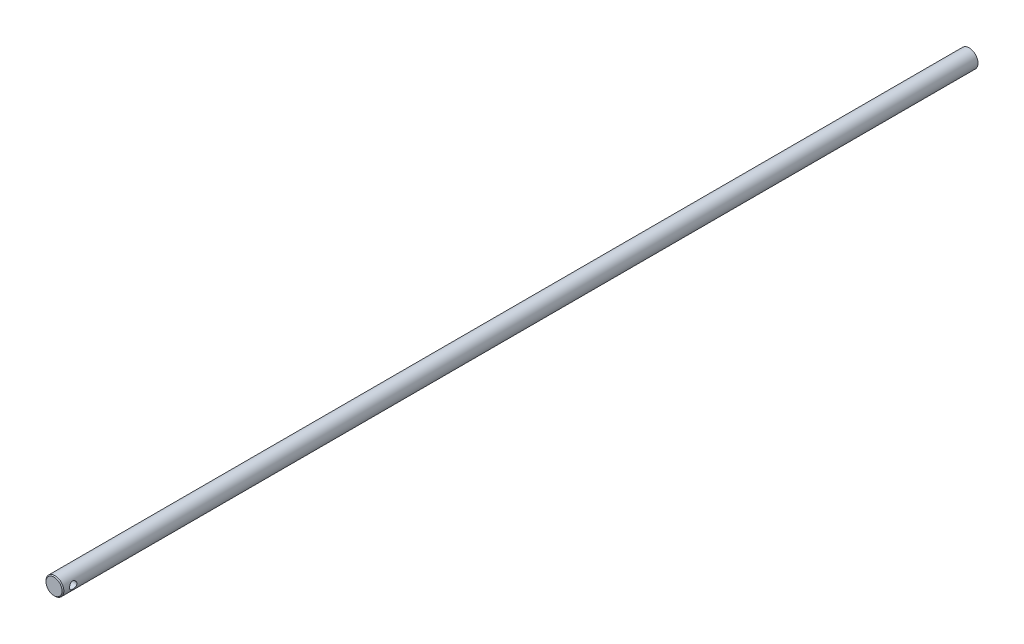
ISO-10303-21;
HEADER;
FILE_DESCRIPTION(('STEP AP214'),'2;1');
FILE_NAME('part.step','',(''),(''),'','','');
FILE_SCHEMA(('AUTOMOTIVE_DESIGN { 1 0 10303 214 1 1 1 1 }'));
ENDSEC;
DATA;
#1=APPLICATION_CONTEXT('core data for automotive mechanical design processes');
#2=APPLICATION_PROTOCOL_DEFINITION('international standard','automotive_design',2000,#1);
#3=PRODUCT_CONTEXT('',#1,'mechanical');
#4=PRODUCT('Part','Part','',(#3));
#5=PRODUCT_RELATED_PRODUCT_CATEGORY('part','',(#4));
#6=PRODUCT_DEFINITION_FORMATION('','',#4);
#7=PRODUCT_DEFINITION_CONTEXT('part definition',#1,'design');
#8=PRODUCT_DEFINITION('design','',#6,#7);
#9=PRODUCT_DEFINITION_SHAPE('','',#8);
#10=(LENGTH_UNIT() NAMED_UNIT(*) SI_UNIT(.MILLI.,.METRE.));
#11=(NAMED_UNIT(*) PLANE_ANGLE_UNIT() SI_UNIT($,.RADIAN.));
#12=(NAMED_UNIT(*) SI_UNIT($,.STERADIAN.) SOLID_ANGLE_UNIT());
#13=UNCERTAINTY_MEASURE_WITH_UNIT(LENGTH_MEASURE(1.E-05),#10,'distance_accuracy_value','');
#14=(GEOMETRIC_REPRESENTATION_CONTEXT(3) GLOBAL_UNCERTAINTY_ASSIGNED_CONTEXT((#13)) GLOBAL_UNIT_ASSIGNED_CONTEXT((#10,
#11,#12)) REPRESENTATION_CONTEXT('',''));
#15=CARTESIAN_POINT('',(0.,0.,0.));
#16=DIRECTION('',(0.,0.,1.));
#17=DIRECTION('',(1.,0.,0.));
#18=AXIS2_PLACEMENT_3D('',#15,#16,#17);
#19=CARTESIAN_POINT('',(21.,0.,-1000.));
#20=DIRECTION('',(0.,0.,1.));
#21=DIRECTION('',(1.,0.,0.));
#22=AXIS2_PLACEMENT_3D('',#19,#20,#21);
#23=CYLINDRICAL_SURFACE('',#22,10.);
#24=CARTESIAN_POINT('',(21.,0.,24.6));
#25=DIRECTION('',(0.,0.,1.));
#26=DIRECTION('',(1.,0.,0.));
#27=AXIS2_PLACEMENT_3D('',#24,#25,#26);
#28=CIRCLE('',#27,10.);
#29=CARTESIAN_POINT('',(31.,0.,24.6));
#30=VERTEX_POINT('',#29);
#31=EDGE_CURVE('E10',#30,#30,#28,.F.);
#32=ORIENTED_EDGE('',*,*,#31,.T.);
#33=EDGE_LOOP('',(#32));
#34=FACE_BOUND('',#33,.T.);
#35=CARTESIAN_POINT('',(31.,0.,18.1));
#36=CARTESIAN_POINT('',(30.9999994237957,0.110007668732783,18.0999992616096));
#37=CARTESIAN_POINT('',(30.9981796076146,0.220054988478877,18.0955662486488));
#38=CARTESIAN_POINT('',(30.9909465222807,0.439366410277693,18.0778763206653));
#39=CARTESIAN_POINT('',(30.9855309281975,0.548629959334096,18.0646136966458));
#40=CARTESIAN_POINT('',(30.9712321148999,0.765755400161878,18.0293588229626));
#41=CARTESIAN_POINT('',(30.9623416539073,0.873613875429732,18.0073483407458));
#42=CARTESIAN_POINT('',(30.9413327010412,1.08693380274593,17.9548280463512));
#43=CARTESIAN_POINT('',(30.9292128900254,1.19239425608763,17.9243147606688));
#44=CARTESIAN_POINT('',(30.8885537455577,1.50329741822684,17.8206802255173));
#45=CARTESIAN_POINT('',(30.8556463269751,1.70423712669609,17.7353034126181));
#46=CARTESIAN_POINT('',(30.7814100182199,2.08865332920929,17.5347709977634));
#47=CARTESIAN_POINT('',(30.7400838295807,2.2721353976665,17.4196249453988));
#48=CARTESIAN_POINT('',(30.6508987462926,2.62580879886724,17.1568661656587));
#49=CARTESIAN_POINT('',(30.602830419481,2.79503948848889,17.0080322997062));
#50=CARTESIAN_POINT('',(30.5064814372417,3.10701103752555,16.6845769051516));
#51=CARTESIAN_POINT('',(30.4582006861016,3.24973835496845,16.509942274955));
#52=CARTESIAN_POINT('',(30.3884025553704,3.4442652274515,16.2273281297025));
#53=CARTESIAN_POINT('',(30.365080389324,3.5070187697387,16.1271645088541));
#54=CARTESIAN_POINT('',(30.3205107752372,3.62380746819965,15.9214546605298));
#55=CARTESIAN_POINT('',(30.2992624853683,3.67784616776472,15.8159106437733));
#56=CARTESIAN_POINT('',(30.2595391210085,3.77674187996856,15.6000982906056));
#57=CARTESIAN_POINT('',(30.2410641856651,3.821598431953,15.4898297175062));
#58=CARTESIAN_POINT('',(30.2075465949663,3.90166255463825,15.2653907348278));
#59=CARTESIAN_POINT('',(30.1925021941414,3.9368750341238,15.1512223436453));
#60=CARTESIAN_POINT('',(30.1670062966293,3.99587040791576,14.925212273466));
#61=CARTESIAN_POINT('',(30.1563734264052,4.0201094906887,14.8135101297345));
#62=CARTESIAN_POINT('',(30.1391133511628,4.05919515609123,14.5882161020673));
#63=CARTESIAN_POINT('',(30.1324843122931,4.07404603888865,14.474625107805));
#64=CARTESIAN_POINT('',(30.1234725000908,4.09418760517082,14.2464568133258));
#65=CARTESIAN_POINT('',(30.1210887134815,4.09948056998857,14.1318797550297));
#66=CARTESIAN_POINT('',(30.1206544731586,4.10044659531371,13.9026815485839));
#67=CARTESIAN_POINT('',(30.1226038020871,4.09612013835092,13.7880604029342));
#68=CARTESIAN_POINT('',(30.1304599282422,4.07857649864667,13.5681948611061));
#69=CARTESIAN_POINT('',(30.1360629071463,4.06604157482802,13.4628847716307));
#70=CARTESIAN_POINT('',(30.1507345614835,4.03291134125424,13.253775182038));
#71=CARTESIAN_POINT('',(30.1598043733125,4.0123133884593,13.1499761888378));
#72=CARTESIAN_POINT('',(30.1918197174623,3.93870485151611,12.8419544468166));
#73=CARTESIAN_POINT('',(30.2195784551596,3.87386456385523,12.6409231646171));
#74=CARTESIAN_POINT('',(30.2854271210957,3.71328039262524,12.2485697309943));
#75=CARTESIAN_POINT('',(30.323721254028,3.61691769214166,12.0575391193832));
#76=CARTESIAN_POINT('',(30.4062758112076,3.39644169708572,11.6936033772617));
#77=CARTESIAN_POINT('',(30.4505385421496,3.27231766126444,11.52070530062));
#78=CARTESIAN_POINT('',(30.5444378554572,2.98795406810727,11.183136047438));
#79=CARTESIAN_POINT('',(30.5942182533053,2.82559427398738,11.0202867433212));
#80=CARTESIAN_POINT('',(30.6904877977571,2.47535965100171,10.7235253209895));
#81=CARTESIAN_POINT('',(30.7369762197146,2.28747923080461,10.5896195607412));
#82=CARTESIAN_POINT('',(30.8226970495738,1.88615207259605,10.3519935628757));
#83=CARTESIAN_POINT('',(30.8617500677408,1.67223893521029,10.2489915740454));
#84=CARTESIAN_POINT('',(30.9268315697475,1.22811223659011,10.0810694979683));
#85=CARTESIAN_POINT('',(30.9528670153487,0.997907463438408,10.0161290523069));
#86=CARTESIAN_POINT('',(30.9876922021884,0.542970639598992,9.92993342728882));
#87=CARTESIAN_POINT('',(30.9974458284395,0.318775553924428,9.90623278484898));
#88=CARTESIAN_POINT('',(31.0016687207945,-0.130580777276467,9.89592708833376));
#89=CARTESIAN_POINT('',(30.9961421998959,-0.355741739402709,9.90931180919273));
#90=CARTESIAN_POINT('',(30.9710534691312,-0.789335598166545,9.9710263566222));
#91=CARTESIAN_POINT('',(30.9521735334948,-0.998054052575003,10.0176583564702));
#92=CARTESIAN_POINT('',(30.9029964517897,-1.40449144493458,10.1422029242685));
#93=CARTESIAN_POINT('',(30.8726978526993,-1.60220897934551,10.2201194732514));
#94=CARTESIAN_POINT('',(30.8024391519496,-1.98791933322147,10.4075659373278));
#95=CARTESIAN_POINT('',(30.7622093870517,-2.17542272920153,10.5179984895789));
#96=CARTESIAN_POINT('',(30.6764086994885,-2.52990690107346,10.7663576028603));
#97=CARTESIAN_POINT('',(30.6308355832814,-2.69687919054465,10.9042954717142));
#98=CARTESIAN_POINT('',(30.5353788197837,-3.01769453453924,11.2148989814511));
#99=CARTESIAN_POINT('',(30.4854152789937,-3.1698265400511,11.3893085148007));
#100=CARTESIAN_POINT('',(30.3896567266102,-3.44316497888079,11.7621511752201));
#101=CARTESIAN_POINT('',(30.3438625537674,-3.56436519846253,11.9605891174536));
#102=CARTESIAN_POINT('',(30.2821945375182,-3.72075962648744,12.2737756989423));
#103=CARTESIAN_POINT('',(30.2627034707524,-3.76889001193941,12.3815289825043));
#104=CARTESIAN_POINT('',(30.226855306065,-3.85582088347276,12.6012233013773));
#105=CARTESIAN_POINT('',(30.2104968365667,-3.89462545467639,12.7131624781572));
#106=CARTESIAN_POINT('',(30.181509294866,-3.96248027578095,12.9403743240659));
#107=CARTESIAN_POINT('',(30.1688786087311,-3.99153474770658,13.055645526801));
#108=CARTESIAN_POINT('',(30.1478179223961,-4.03956904872029,13.2886456183618));
#109=CARTESIAN_POINT('',(30.1393875448982,-4.05854978270396,13.4063742854526));
#110=CARTESIAN_POINT('',(30.1275257417985,-4.08515211375238,13.6343554148125));
#111=CARTESIAN_POINT('',(30.1237660211121,-4.09352069056869,13.7445041956611));
#112=CARTESIAN_POINT('',(30.1202538145068,-4.10133990874792,13.9652204878105));
#113=CARTESIAN_POINT('',(30.1205026714204,-4.10078756169263,14.0757881270235));
#114=CARTESIAN_POINT('',(30.1250039564215,-4.09076222395262,14.2963840349031));
#115=CARTESIAN_POINT('',(30.1292543225273,-4.08129382771665,14.4064125520285));
#116=CARTESIAN_POINT('',(30.1416000993579,-4.05356196016499,14.6251500133219));
#117=CARTESIAN_POINT('',(30.1496969593284,-4.03529517383895,14.7338584442749));
#118=CARTESIAN_POINT('',(30.1785074826854,-3.96954781238336,15.0472748081257));
#119=CARTESIAN_POINT('',(30.203996362995,-3.91061144074647,15.2492697556475));
#120=CARTESIAN_POINT('',(30.265179208111,-3.76334149729218,15.6404441347904));
#121=CARTESIAN_POINT('',(30.300876020882,-3.67499972037675,15.8296199716956));
#122=CARTESIAN_POINT('',(30.3810629206335,-3.46539202644625,16.2021229687966));
#123=CARTESIAN_POINT('',(30.4259476296189,-3.34249071273536,16.3844460473848));
#124=CARTESIAN_POINT('',(30.5183064564328,-3.069625718751,16.726792835827));
#125=CARTESIAN_POINT('',(30.5657814219629,-2.9196531414674,16.8868091838083));
#126=CARTESIAN_POINT('',(30.6619621812109,-2.58434486952391,17.1915312342366));
#127=CARTESIAN_POINT('',(30.7105238639014,-2.39727493130112,17.3343975666323));
#128=CARTESIAN_POINT('',(30.7776325734815,-2.09960427807816,17.5235720217768));
#129=CARTESIAN_POINT('',(30.7990617921292,-1.99744522049399,17.5824808138427));
#130=CARTESIAN_POINT('',(30.8394204750672,-1.78805531017718,17.6914442444853));
#131=CARTESIAN_POINT('',(30.8583510881264,-1.6808268192031,17.7415029556292));
#132=CARTESIAN_POINT('',(30.8928725706325,-1.46387782142196,17.8315305535072));
#133=CARTESIAN_POINT('',(30.9085146153568,-1.35423037364135,17.8716560976809));
#134=CARTESIAN_POINT('',(30.9364050709552,-1.13156178433276,17.9424873201849));
#135=CARTESIAN_POINT('',(30.9486550850855,-1.01854226470596,17.9731974494853));
#136=CARTESIAN_POINT('',(30.9693835834044,-0.790251734601273,18.024818825994));
#137=CARTESIAN_POINT('',(30.9778714436537,-0.674987077293636,18.0457544403361));
#138=CARTESIAN_POINT('',(30.9908609236637,-0.442925113311983,18.0776852470123));
#139=CARTESIAN_POINT('',(30.9953655064074,-0.326129011555006,18.0886878282159));
#140=CARTESIAN_POINT('',(30.9985422751595,-0.174267574962145,18.0964433637312));
#141=CARTESIAN_POINT('',(30.9990886506645,-0.139430869289147,18.0977767665838));
#142=CARTESIAN_POINT('',(30.9998176046427,-0.0697307702130654,18.099555202329));
#143=CARTESIAN_POINT('',(31.0000001826303,-0.0348673767744216,18.1000002340358));
#144=CARTESIAN_POINT('',(31.,0.,18.1));
#145=B_SPLINE_CURVE_WITH_KNOTS('',3,(#35,#36,#37,#38,#39,#40,#41,#42,#43,#44,#45,#46,#47,#48,
#49,#50,#51,#52,#53,#54,#55,#56,#57,#58,#59,#60,#61,#62,#63,#64,#65,#66,#67,#68,#69,#70,#71,#72,
#73,#74,#75,#76,#77,#78,#79,#80,#81,#82,#83,#84,#85,#86,#87,#88,#89,#90,#91,#92,#93,#94,#95,#96,
#97,#98,#99,#100,#101,#102,#103,#104,#105,#106,#107,#108,#109,#110,#111,#112,#113,#114,#115,
#116,#117,#118,#119,#120,#121,#122,#123,#124,#125,#126,#127,#128,#129,#130,#131,#132,#133,#134,
#135,#136,#137,#138,#139,#140,#141,#142,#143,#144),.UNSPECIFIED.,.T.,.F.,(4,2,2,2,2,2,2,2,2,2,2,
2,2,2,2,2,2,2,2,2,2,2,2,2,2,2,2,2,2,2,2,2,2,2,2,2,2,2,2,2,2,2,2,2,2,2,2,2,2,2,2,2,2,2,4),(0.,
0.329987197568169,0.660187963757902,0.991080584202126,1.32210857720334,1.98122995645147,
2.64014015978553,3.32850217464839,4.01721494798737,4.37826845718778,4.73917479252578,
5.1000992295485,5.46083961497197,5.80476791296676,6.14853856380483,6.49222715084578,
6.83589849815504,7.15411460119262,7.47243510210383,8.10852937236304,8.75794632298871,
9.40761497813452,10.1102842077799,10.8131076347612,11.531185611382,12.2488791500404,
12.9223452463347,13.5956256750467,14.2367814997529,14.8780189389202,15.5390749136656,
16.2004032202496,16.9075490019215,17.6148367270535,17.9732798157748,18.3315656030852,
18.6896960433326,19.0477943082816,19.3789589742977,19.7102345793878,20.0413395711992,
20.3725694126806,21.0053844418792,21.6383761960053,22.3087254406928,22.9792953990897,
23.6965121218593,24.0557128195315,24.4147477900929,24.7676963945603,25.1204778906549,
25.4723751701607,25.8240104681994,25.9286011092248,26.0331918898575),.UNSPECIFIED.);
#146=CARTESIAN_POINT('',(31.,0.,18.1));
#147=VERTEX_POINT('',#146);
#148=EDGE_CURVE('E46',#147,#147,#145,.T.);
#149=ORIENTED_EDGE('',*,*,#148,.T.);
#150=EDGE_LOOP('',(#149));
#151=FACE_BOUND('',#150,.T.);
#152=CARTESIAN_POINT('',(21.,0.,-1000.));
#153=DIRECTION('',(0.,0.,1.));
#154=DIRECTION('',(1.,0.,0.));
#155=AXIS2_PLACEMENT_3D('',#152,#153,#154);
#156=CIRCLE('',#155,10.);
#157=CARTESIAN_POINT('',(31.,0.,-1000.));
#158=VERTEX_POINT('',#157);
#159=EDGE_CURVE('E50',#158,#158,#156,.T.);
#160=ORIENTED_EDGE('',*,*,#159,.T.);
#161=EDGE_LOOP('',(#160));
#162=FACE_BOUND('',#161,.T.);
#163=CARTESIAN_POINT('',(11.,0.,18.1));
#164=CARTESIAN_POINT('',(11.0000005762043,-0.110007668732776,18.0999992616096));
#165=CARTESIAN_POINT('',(11.0018203923854,-0.22005498847887,18.0955662486488));
#166=CARTESIAN_POINT('',(11.0090534777193,-0.439366410277685,18.0778763206653));
#167=CARTESIAN_POINT('',(11.0144690718025,-0.548629959334088,18.0646136966458));
#168=CARTESIAN_POINT('',(11.0287678851001,-0.76575540016187,18.0293588229626));
#169=CARTESIAN_POINT('',(11.0376583460927,-0.873613875429723,18.0073483407458));
#170=CARTESIAN_POINT('',(11.0586672989588,-1.08693380274592,17.9548280463512));
#171=CARTESIAN_POINT('',(11.0707871099746,-1.19239425608762,17.9243147606688));
#172=CARTESIAN_POINT('',(11.1114462544423,-1.50329741822683,17.8206802255173));
#173=CARTESIAN_POINT('',(11.1443536730249,-1.70423712669608,17.7353034126181));
#174=CARTESIAN_POINT('',(11.2185899817801,-2.08865332920928,17.5347709977634));
#175=CARTESIAN_POINT('',(11.2599161704193,-2.27213539766649,17.4196249453988));
#176=CARTESIAN_POINT('',(11.3491012537074,-2.62580879886723,17.1568661656587));
#177=CARTESIAN_POINT('',(11.397169580519,-2.79503948848888,17.0080322997062));
#178=CARTESIAN_POINT('',(11.4935185627583,-3.10701103752555,16.6845769051516));
#179=CARTESIAN_POINT('',(11.5417993138984,-3.24973835496844,16.509942274955));
#180=CARTESIAN_POINT('',(11.6115974446297,-3.44426522745149,16.2273281297025));
#181=CARTESIAN_POINT('',(11.634919610676,-3.5070187697387,16.1271645088541));
#182=CARTESIAN_POINT('',(11.6794892247628,-3.62380746819964,15.9214546605298));
#183=CARTESIAN_POINT('',(11.7007375146317,-3.67784616776472,15.8159106437733));
#184=CARTESIAN_POINT('',(11.7404608789915,-3.77674187996856,15.6000982906056));
#185=CARTESIAN_POINT('',(11.758935814335,-3.821598431953,15.4898297175062));
#186=CARTESIAN_POINT('',(11.7924534050337,-3.90166255463824,15.2653907348278));
#187=CARTESIAN_POINT('',(11.8074978058586,-3.9368750341238,15.1512223436453));
#188=CARTESIAN_POINT('',(11.8329937033707,-3.99587040791576,14.925212273466));
#189=CARTESIAN_POINT('',(11.8436265735948,-4.0201094906887,14.8135101297345));
#190=CARTESIAN_POINT('',(11.8608866488373,-4.05919515609123,14.5882161020673));
#191=CARTESIAN_POINT('',(11.8675156877069,-4.07404603888864,14.474625107805));
#192=CARTESIAN_POINT('',(11.8765274999092,-4.09418760517081,14.2464568133258));
#193=CARTESIAN_POINT('',(11.8789112865185,-4.09948056998856,14.1318797550297));
#194=CARTESIAN_POINT('',(11.8793455268414,-4.1004465953137,13.9026815485839));
#195=CARTESIAN_POINT('',(11.8773961979129,-4.09612013835091,13.7880604029342));
#196=CARTESIAN_POINT('',(11.8695400717578,-4.07857649864666,13.5681948611061));
#197=CARTESIAN_POINT('',(11.8639370928537,-4.06604157482801,13.4628847716307));
#198=CARTESIAN_POINT('',(11.8492654385165,-4.03291134125423,13.253775182038));
#199=CARTESIAN_POINT('',(11.8401956266876,-4.01231338845929,13.1499761888378));
#200=CARTESIAN_POINT('',(11.8081802825378,-3.93870485151611,12.8419544468166));
#201=CARTESIAN_POINT('',(11.7804215448404,-3.87386456385522,12.6409231646171));
#202=CARTESIAN_POINT('',(11.7145728789044,-3.71328039262523,12.2485697309943));
#203=CARTESIAN_POINT('',(11.6762787459721,-3.61691769214165,12.0575391193832));
#204=CARTESIAN_POINT('',(11.5937241887924,-3.39644169708571,11.6936033772617));
#205=CARTESIAN_POINT('',(11.5494614578504,-3.27231766126443,11.52070530062));
#206=CARTESIAN_POINT('',(11.4555621445428,-2.98795406810726,11.183136047438));
#207=CARTESIAN_POINT('',(11.4057817466947,-2.82559427398737,11.0202867433212));
#208=CARTESIAN_POINT('',(11.3095122022429,-2.47535965100171,10.7235253209895));
#209=CARTESIAN_POINT('',(11.2630237802854,-2.2874792308046,10.5896195607412));
#210=CARTESIAN_POINT('',(11.1773029504262,-1.88615207259604,10.3519935628757));
#211=CARTESIAN_POINT('',(11.1382499322592,-1.67223893521028,10.2489915740454));
#212=CARTESIAN_POINT('',(11.0731684302526,-1.2281122365901,10.0810694979683));
#213=CARTESIAN_POINT('',(11.0471329846513,-0.997907463438399,10.0161290523069));
#214=CARTESIAN_POINT('',(11.0123077978116,-0.542970639598983,9.92993342728882));
#215=CARTESIAN_POINT('',(11.0025541715605,-0.31877555392442,9.90623278484898));
#216=CARTESIAN_POINT('',(10.9983312792055,0.130580777276474,9.89592708833376));
#217=CARTESIAN_POINT('',(11.0038578001041,0.355741739402716,9.90931180919273));
#218=CARTESIAN_POINT('',(11.0289465308689,0.789335598166553,9.9710263566222));
#219=CARTESIAN_POINT('',(11.0478264665052,0.99805405257501,10.0176583564702));
#220=CARTESIAN_POINT('',(11.0970035482103,1.40449144493459,10.1422029242685));
#221=CARTESIAN_POINT('',(11.1273021473007,1.60220897934551,10.2201194732514));
#222=CARTESIAN_POINT('',(11.1975608480504,1.98791933322147,10.4075659373278));
#223=CARTESIAN_POINT('',(11.2377906129483,2.17542272920154,10.5179984895789));
#224=CARTESIAN_POINT('',(11.3235913005115,2.52990690107346,10.7663576028603));
#225=CARTESIAN_POINT('',(11.3691644167186,2.69687919054465,10.9042954717142));
#226=CARTESIAN_POINT('',(11.4646211802164,3.01769453453924,11.2148989814511));
#227=CARTESIAN_POINT('',(11.5145847210063,3.1698265400511,11.3893085148007));
#228=CARTESIAN_POINT('',(11.6103432733898,3.44316497888079,11.7621511752201));
#229=CARTESIAN_POINT('',(11.6561374462326,3.56436519846254,11.9605891174536));
#230=CARTESIAN_POINT('',(11.7178054624818,3.72075962648744,12.2737756989423));
#231=CARTESIAN_POINT('',(11.7372965292477,3.76889001193941,12.3815289825043));
#232=CARTESIAN_POINT('',(11.773144693935,3.85582088347277,12.6012233013773));
#233=CARTESIAN_POINT('',(11.7895031634333,3.8946254546764,12.7131624781572));
#234=CARTESIAN_POINT('',(11.818490705134,3.96248027578096,12.9403743240659));
#235=CARTESIAN_POINT('',(11.8311213912689,3.99153474770659,13.055645526801));
#236=CARTESIAN_POINT('',(11.8521820776039,4.0395690487203,13.2886456183618));
#237=CARTESIAN_POINT('',(11.8606124551018,4.05854978270397,13.4063742854526));
#238=CARTESIAN_POINT('',(11.8724742582015,4.08515211375238,13.6343554148125));
#239=CARTESIAN_POINT('',(11.8762339788879,4.0935206905687,13.7445041956611));
#240=CARTESIAN_POINT('',(11.8797461854932,4.10133990874792,13.9652204878105));
#241=CARTESIAN_POINT('',(11.8794973285796,4.10078756169264,14.0757881270235));
#242=CARTESIAN_POINT('',(11.8749960435785,4.09076222395263,14.2963840349031));
#243=CARTESIAN_POINT('',(11.8707456774727,4.08129382771666,14.4064125520285));
#244=CARTESIAN_POINT('',(11.8583999006421,4.053561960165,14.6251500133219));
#245=CARTESIAN_POINT('',(11.8503030406716,4.03529517383896,14.7338584442749));
#246=CARTESIAN_POINT('',(11.8214925173146,3.96954781238337,15.0472748081257));
#247=CARTESIAN_POINT('',(11.796003637005,3.91061144074648,15.2492697556475));
#248=CARTESIAN_POINT('',(11.734820791889,3.76334149729218,15.6404441347904));
#249=CARTESIAN_POINT('',(11.699123979118,3.67499972037676,15.8296199716956));
#250=CARTESIAN_POINT('',(11.6189370793665,3.46539202644626,16.2021229687966));
#251=CARTESIAN_POINT('',(11.5740523703811,3.34249071273537,16.3844460473848));
#252=CARTESIAN_POINT('',(11.4816935435673,3.06962571875101,16.726792835827));
#253=CARTESIAN_POINT('',(11.4342185780371,2.91965314146741,16.8868091838083));
#254=CARTESIAN_POINT('',(11.3380378187892,2.58434486952392,17.1915312342366));
#255=CARTESIAN_POINT('',(11.2894761360986,2.39727493130113,17.3343975666323));
#256=CARTESIAN_POINT('',(11.2223674265185,2.09960427807817,17.5235720217768));
#257=CARTESIAN_POINT('',(11.2009382078708,1.997445220494,17.5824808138427));
#258=CARTESIAN_POINT('',(11.1605795249328,1.78805531017719,17.6914442444853));
#259=CARTESIAN_POINT('',(11.1416489118736,1.6808268192031,17.7415029556292));
#260=CARTESIAN_POINT('',(11.1071274293675,1.46387782142196,17.8315305535072));
#261=CARTESIAN_POINT('',(11.0914853846432,1.35423037364135,17.8716560976809));
#262=CARTESIAN_POINT('',(11.0635949290448,1.13156178433277,17.9424873201849));
#263=CARTESIAN_POINT('',(11.0513449149145,1.01854226470596,17.9731974494853));
#264=CARTESIAN_POINT('',(11.0306164165956,0.790251734601282,18.024818825994));
#265=CARTESIAN_POINT('',(11.0221285563463,0.674987077293644,18.0457544403361));
#266=CARTESIAN_POINT('',(11.0091390763363,0.44292511331199,18.0776852470123));
#267=CARTESIAN_POINT('',(11.0046344935926,0.326129011555012,18.0886878282159));
#268=CARTESIAN_POINT('',(11.0014577248405,0.174267574962151,18.0964433637312));
#269=CARTESIAN_POINT('',(11.0009113493355,0.139430869289153,18.0977767665838));
#270=CARTESIAN_POINT('',(11.0001823953574,0.0697307702130728,18.099555202329));
#271=CARTESIAN_POINT('',(10.9999998173697,0.0348673767744288,18.1000002340358));
#272=CARTESIAN_POINT('',(11.,0.,18.1));
#273=B_SPLINE_CURVE_WITH_KNOTS('',3,(#163,#164,#165,#166,#167,#168,#169,#170,#171,#172,#173,
#174,#175,#176,#177,#178,#179,#180,#181,#182,#183,#184,#185,#186,#187,#188,#189,#190,#191,#192,
#193,#194,#195,#196,#197,#198,#199,#200,#201,#202,#203,#204,#205,#206,#207,#208,#209,#210,#211,
#212,#213,#214,#215,#216,#217,#218,#219,#220,#221,#222,#223,#224,#225,#226,#227,#228,#229,#230,
#231,#232,#233,#234,#235,#236,#237,#238,#239,#240,#241,#242,#243,#244,#245,#246,#247,#248,#249,
#250,#251,#252,#253,#254,#255,#256,#257,#258,#259,#260,#261,#262,#263,#264,#265,#266,#267,#268,
#269,#270,#271,#272),.UNSPECIFIED.,.T.,.F.,(4,2,2,2,2,2,2,2,2,2,2,2,2,2,2,2,2,2,2,2,2,2,2,2,2,2,
2,2,2,2,2,2,2,2,2,2,2,2,2,2,2,2,2,2,2,2,2,2,2,2,2,2,2,2,4),(0.,0.329987197568168,
0.660187963757902,0.991080584202123,1.32210857720334,1.98122995645147,2.64014015978553,
3.32850217464839,4.01721494798737,4.37826845718778,4.73917479252578,5.10009922954851,
5.46083961497197,5.80476791296676,6.14853856380484,6.49222715084578,6.83589849815504,
7.15411460119263,7.47243510210383,8.10852937236305,8.75794632298872,9.40761497813452,
10.1102842077799,10.8131076347612,11.531185611382,12.2488791500404,12.9223452463347,
13.5956256750467,14.2367814997529,14.8780189389202,15.5390749136656,16.2004032202496,
16.9075490019215,17.6148367270535,17.9732798157748,18.3315656030852,18.6896960433326,
19.0477943082816,19.3789589742977,19.7102345793878,20.0413395711992,20.3725694126806,
21.0053844418792,21.6383761960053,22.3087254406928,22.9792953990897,23.6965121218593,
24.0557128195315,24.4147477900929,24.7676963945603,25.1204778906549,25.4723751701607,
25.8240104681994,25.9286011092248,26.0331918898575),.UNSPECIFIED.);
#274=CARTESIAN_POINT('',(11.,0.,18.1));
#275=VERTEX_POINT('',#274);
#276=EDGE_CURVE('E53',#275,#275,#273,.T.);
#277=ORIENTED_EDGE('',*,*,#276,.T.);
#278=EDGE_LOOP('',(#277));
#279=FACE_BOUND('',#278,.T.);
#280=ADVANCED_FACE('F34',(#34,#151,#162,#279),#23,.T.);
#281=CARTESIAN_POINT('',(21.,0.,-1000.));
#282=DIRECTION('',(0.,0.,1.));
#283=DIRECTION('',(1.,0.,0.));
#284=AXIS2_PLACEMENT_3D('',#281,#282,#283);
#285=PLANE('',#284);
#286=ORIENTED_EDGE('',*,*,#159,.F.);
#287=EDGE_LOOP('',(#286));
#288=FACE_BOUND('',#287,.T.);
#289=ADVANCED_FACE('F73',(#288),#285,.F.);
#290=CARTESIAN_POINT('',(21.,0.,25.6));
#291=DIRECTION('',(0.,0.,1.));
#292=DIRECTION('',(1.,0.,0.));
#293=AXIS2_PLACEMENT_3D('',#290,#291,#292);
#294=PLANE('',#293);
#295=CARTESIAN_POINT('',(21.,0.,25.6));
#296=DIRECTION('',(0.,0.,1.));
#297=DIRECTION('',(1.,0.,0.));
#298=AXIS2_PLACEMENT_3D('',#295,#296,#297);
#299=CIRCLE('',#298,9.00000000000007);
#300=CARTESIAN_POINT('',(30.0000000000001,0.,25.6));
#301=VERTEX_POINT('',#300);
#302=EDGE_CURVE('E42',#301,#301,#299,.T.);
#303=ORIENTED_EDGE('',*,*,#302,.T.);
#304=EDGE_LOOP('',(#303));
#305=FACE_BOUND('',#304,.T.);
#306=ADVANCED_FACE('F69',(#305),#294,.T.);
#307=CARTESIAN_POINT('',(11.,0.,14.));
#308=DIRECTION('',(-1.,0.,0.));
#309=DIRECTION('',(0.,0.,1.));
#310=AXIS2_PLACEMENT_3D('',#307,#308,#309);
#311=CYLINDRICAL_SURFACE('',#310,4.1);
#312=ORIENTED_EDGE('',*,*,#276,.F.);
#313=EDGE_LOOP('',(#312));
#314=FACE_BOUND('',#313,.T.);
#315=ORIENTED_EDGE('',*,*,#148,.F.);
#316=EDGE_LOOP('',(#315));
#317=FACE_BOUND('',#316,.T.);
#318=ADVANCED_FACE('F65',(#314,#317),#311,.F.);
#319=CARTESIAN_POINT('',(21.,0.,25.6000000000001));
#320=DIRECTION('',(0.,0.,-1.));
#321=DIRECTION('',(-1.,0.,0.));
#322=AXIS2_PLACEMENT_3D('',#319,#320,#321);
#323=CONICAL_SURFACE('',#322,9.00000000000001,0.785398163397387);
#324=ORIENTED_EDGE('',*,*,#31,.F.);
#325=EDGE_LOOP('',(#324));
#326=FACE_BOUND('',#325,.T.);
#327=ORIENTED_EDGE('',*,*,#302,.F.);
#328=EDGE_LOOP('',(#327));
#329=FACE_BOUND('',#328,.T.);
#330=ADVANCED_FACE('F37',(#326,#329),#323,.T.);
#331=CLOSED_SHELL('',(#280,#289,#306,#318,#330));
#332=MANIFOLD_SOLID_BREP('B2',#331);
#333=ADVANCED_BREP_SHAPE_REPRESENTATION('',(#18,#332),#14);
#334=SHAPE_DEFINITION_REPRESENTATION(#9,#333);
ENDSEC;
END-ISO-10303-21;
